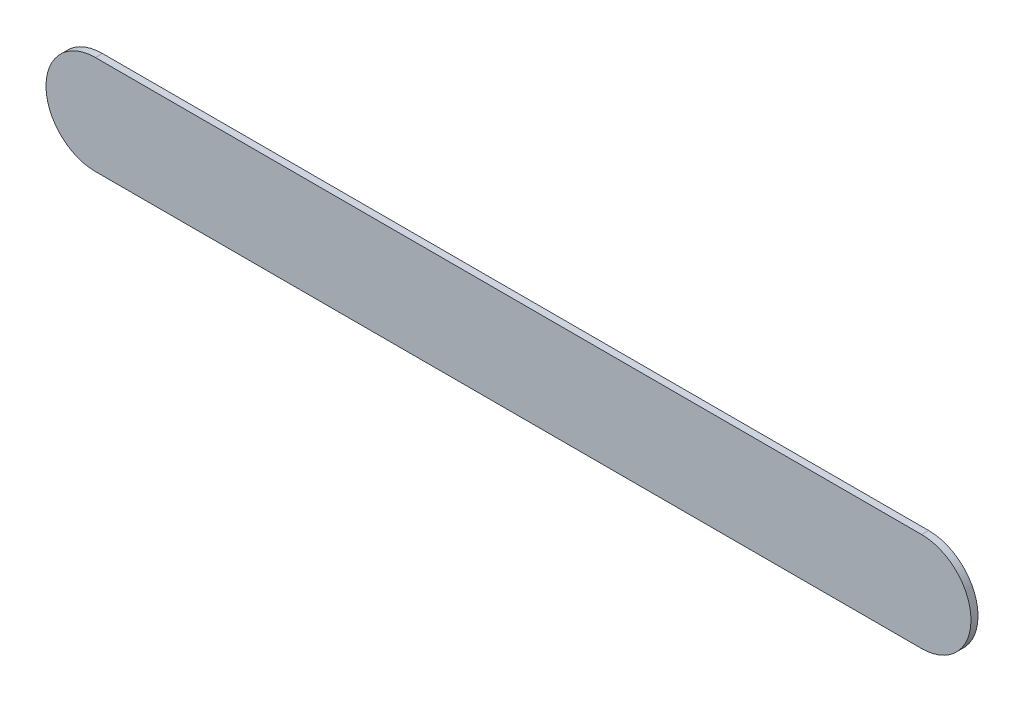
ISO-10303-21;
HEADER;
FILE_DESCRIPTION(('STEP AP214'),'2;1');
FILE_NAME('part.step','',(''),(''),'','','');
FILE_SCHEMA(('AUTOMOTIVE_DESIGN { 1 0 10303 214 1 1 1 1 }'));
ENDSEC;
DATA;
#1=APPLICATION_CONTEXT('core data for automotive mechanical design processes');
#2=APPLICATION_PROTOCOL_DEFINITION('international standard','automotive_design',2000,#1);
#3=PRODUCT_CONTEXT('',#1,'mechanical');
#4=PRODUCT('Part','Part','',(#3));
#5=PRODUCT_RELATED_PRODUCT_CATEGORY('part','',(#4));
#6=PRODUCT_DEFINITION_FORMATION('','',#4);
#7=PRODUCT_DEFINITION_CONTEXT('part definition',#1,'design');
#8=PRODUCT_DEFINITION('design','',#6,#7);
#9=PRODUCT_DEFINITION_SHAPE('','',#8);
#10=(LENGTH_UNIT() NAMED_UNIT(*) SI_UNIT(.MILLI.,.METRE.));
#11=(NAMED_UNIT(*) PLANE_ANGLE_UNIT() SI_UNIT($,.RADIAN.));
#12=(NAMED_UNIT(*) SI_UNIT($,.STERADIAN.) SOLID_ANGLE_UNIT());
#13=UNCERTAINTY_MEASURE_WITH_UNIT(LENGTH_MEASURE(1.E-05),#10,'distance_accuracy_value','');
#14=(GEOMETRIC_REPRESENTATION_CONTEXT(3) GLOBAL_UNCERTAINTY_ASSIGNED_CONTEXT((#13)) GLOBAL_UNIT_ASSIGNED_CONTEXT((#10,
#11,#12)) REPRESENTATION_CONTEXT('',''));
#15=CARTESIAN_POINT('',(0.,0.,0.));
#16=DIRECTION('',(0.,0.,1.));
#17=DIRECTION('',(1.,0.,0.));
#18=AXIS2_PLACEMENT_3D('',#15,#16,#17);
#19=CARTESIAN_POINT('',(88.36201276,97.71201184,0.));
#20=DIRECTION('',(0.,1.,0.));
#21=DIRECTION('',(1.,0.,0.));
#22=AXIS2_PLACEMENT_3D('',#19,#20,#21);
#23=PLANE('',#22);
#24=DIRECTION('',(1.,0.,0.));
#25=VECTOR('',#24,1.);
#26=CARTESIAN_POINT('',(88.36201276,97.71201184,0.03556));
#27=LINE('',#26,#25);
#28=CARTESIAN_POINT('',(88.36201276,97.71201184,0.03556));
#29=VERTEX_POINT('',#28);
#30=CARTESIAN_POINT('',(92.54500414,97.71201184,0.03556));
#31=VERTEX_POINT('',#30);
#32=EDGE_CURVE('E11',#29,#31,#27,.T.);
#33=ORIENTED_EDGE('',*,*,#32,.F.);
#34=DIRECTION('',(0.,0.,1.));
#35=VECTOR('',#34,1.);
#36=CARTESIAN_POINT('',(88.36201276,97.71201184,0.));
#37=LINE('',#36,#35);
#38=CARTESIAN_POINT('',(88.36201276,97.71201184,0.));
#39=VERTEX_POINT('',#38);
#40=EDGE_CURVE('E24',#39,#29,#37,.T.);
#41=ORIENTED_EDGE('',*,*,#40,.F.);
#42=DIRECTION('',(1.,0.,0.));
#43=VECTOR('',#42,1.);
#44=CARTESIAN_POINT('',(88.36201276,97.71201184,0.));
#45=LINE('',#44,#43);
#46=CARTESIAN_POINT('',(92.54500414,97.71201184,0.));
#47=VERTEX_POINT('',#46);
#48=EDGE_CURVE('E75',#39,#47,#45,.T.);
#49=ORIENTED_EDGE('',*,*,#48,.T.);
#50=DIRECTION('',(0.,0.,1.));
#51=VECTOR('',#50,1.);
#52=CARTESIAN_POINT('',(92.54500414,97.71201184,0.));
#53=LINE('',#52,#51);
#54=EDGE_CURVE('E37',#47,#31,#53,.T.);
#55=ORIENTED_EDGE('',*,*,#54,.T.);
#56=EDGE_LOOP('',(#33,#41,#49,#55));
#57=FACE_BOUND('',#56,.T.);
#58=ADVANCED_FACE('F17',(#57),#23,.F.);
#59=CARTESIAN_POINT('',(92.54500414,97.96201134,0.));
#60=DIRECTION('',(0.,0.,-1.));
#61=DIRECTION('',(0.,-1.,0.));
#62=AXIS2_PLACEMENT_3D('',#59,#60,#61);
#63=CYLINDRICAL_SURFACE('',#62,0.249999500000001);
#64=CARTESIAN_POINT('',(92.54500414,97.96201134,0.03556));
#65=DIRECTION('',(0.,0.,1.));
#66=DIRECTION('',(0.,-1.,0.));
#67=AXIS2_PLACEMENT_3D('',#64,#65,#66);
#68=CIRCLE('',#67,0.249999500000001);
#69=CARTESIAN_POINT('',(92.54500414,98.21201084,0.03556));
#70=VERTEX_POINT('',#69);
#71=EDGE_CURVE('E83',#31,#70,#68,.T.);
#72=ORIENTED_EDGE('',*,*,#71,.F.);
#73=ORIENTED_EDGE('',*,*,#54,.F.);
#74=CARTESIAN_POINT('',(92.54500414,97.96201134,0.));
#75=DIRECTION('',(0.,0.,1.));
#76=DIRECTION('',(0.,-1.,0.));
#77=AXIS2_PLACEMENT_3D('',#74,#75,#76);
#78=CIRCLE('',#77,0.249999500000001);
#79=CARTESIAN_POINT('',(92.54500414,98.21201084,0.));
#80=VERTEX_POINT('',#79);
#81=EDGE_CURVE('E81',#47,#80,#78,.T.);
#82=ORIENTED_EDGE('',*,*,#81,.T.);
#83=DIRECTION('',(0.,0.,1.));
#84=VECTOR('',#83,1.);
#85=CARTESIAN_POINT('',(92.54500414,98.21201084,0.));
#86=LINE('',#85,#84);
#87=EDGE_CURVE('E67',#80,#70,#86,.T.);
#88=ORIENTED_EDGE('',*,*,#87,.T.);
#89=EDGE_LOOP('',(#72,#73,#82,#88));
#90=FACE_BOUND('',#89,.T.);
#91=ADVANCED_FACE('F89',(#90),#63,.T.);
#92=CARTESIAN_POINT('',(92.54500414,98.21201084,0.));
#93=DIRECTION('',(0.,-1.,0.));
#94=DIRECTION('',(-1.,0.,0.));
#95=AXIS2_PLACEMENT_3D('',#92,#93,#94);
#96=PLANE('',#95);
#97=DIRECTION('',(-1.,0.,0.));
#98=VECTOR('',#97,1.);
#99=CARTESIAN_POINT('',(92.54500414,98.21201084,0.03556));
#100=LINE('',#99,#98);
#101=CARTESIAN_POINT('',(88.36201276,98.21201084,0.03556));
#102=VERTEX_POINT('',#101);
#103=EDGE_CURVE('E71',#70,#102,#100,.T.);
#104=ORIENTED_EDGE('',*,*,#103,.F.);
#105=ORIENTED_EDGE('',*,*,#87,.F.);
#106=DIRECTION('',(-1.,0.,0.));
#107=VECTOR('',#106,1.);
#108=CARTESIAN_POINT('',(92.54500414,98.21201084,0.));
#109=LINE('',#108,#107);
#110=CARTESIAN_POINT('',(88.36201276,98.21201084,0.));
#111=VERTEX_POINT('',#110);
#112=EDGE_CURVE('E63',#80,#111,#109,.T.);
#113=ORIENTED_EDGE('',*,*,#112,.T.);
#114=DIRECTION('',(0.,0.,1.));
#115=VECTOR('',#114,1.);
#116=CARTESIAN_POINT('',(88.36201276,98.21201084,0.));
#117=LINE('',#116,#115);
#118=EDGE_CURVE('E53',#111,#102,#117,.T.);
#119=ORIENTED_EDGE('',*,*,#118,.T.);
#120=EDGE_LOOP('',(#104,#105,#113,#119));
#121=FACE_BOUND('',#120,.T.);
#122=ADVANCED_FACE('F66',(#121),#96,.F.);
#123=CARTESIAN_POINT('',(88.36201276,97.96201134,0.));
#124=DIRECTION('',(0.,0.,-1.));
#125=DIRECTION('',(0.,1.,0.));
#126=AXIS2_PLACEMENT_3D('',#123,#124,#125);
#127=CYLINDRICAL_SURFACE('',#126,0.249999500000001);
#128=CARTESIAN_POINT('',(88.36201276,97.96201134,0.03556));
#129=DIRECTION('',(0.,0.,1.));
#130=DIRECTION('',(0.,1.,0.));
#131=AXIS2_PLACEMENT_3D('',#128,#129,#130);
#132=CIRCLE('',#131,0.249999500000001);
#133=EDGE_CURVE('E59',#102,#29,#132,.T.);
#134=ORIENTED_EDGE('',*,*,#133,.F.);
#135=ORIENTED_EDGE('',*,*,#118,.F.);
#136=CARTESIAN_POINT('',(88.36201276,97.96201134,0.));
#137=DIRECTION('',(0.,0.,1.));
#138=DIRECTION('',(0.,1.,0.));
#139=AXIS2_PLACEMENT_3D('',#136,#137,#138);
#140=CIRCLE('',#139,0.249999500000001);
#141=EDGE_CURVE('E57',#111,#39,#140,.T.);
#142=ORIENTED_EDGE('',*,*,#141,.T.);
#143=ORIENTED_EDGE('',*,*,#40,.T.);
#144=EDGE_LOOP('',(#134,#135,#142,#143));
#145=FACE_BOUND('',#144,.T.);
#146=ADVANCED_FACE('F55',(#145),#127,.T.);
#147=CARTESIAN_POINT('',(88.36201276,97.71201184,0.));
#148=DIRECTION('',(0.,0.,-1.));
#149=DIRECTION('',(-1.,0.,0.));
#150=AXIS2_PLACEMENT_3D('',#147,#148,#149);
#151=PLANE('',#150);
#152=ORIENTED_EDGE('',*,*,#141,.F.);
#153=ORIENTED_EDGE('',*,*,#112,.F.);
#154=ORIENTED_EDGE('',*,*,#81,.F.);
#155=ORIENTED_EDGE('',*,*,#48,.F.);
#156=EDGE_LOOP('',(#152,#153,#154,#155));
#157=FACE_BOUND('',#156,.T.);
#158=ADVANCED_FACE('F74',(#157),#151,.T.);
#159=CARTESIAN_POINT('',(88.36201276,97.71201184,0.03556));
#160=DIRECTION('',(0.,0.,-1.));
#161=DIRECTION('',(-1.,0.,0.));
#162=AXIS2_PLACEMENT_3D('',#159,#160,#161);
#163=PLANE('',#162);
#164=ORIENTED_EDGE('',*,*,#32,.T.);
#165=ORIENTED_EDGE('',*,*,#71,.T.);
#166=ORIENTED_EDGE('',*,*,#103,.T.);
#167=ORIENTED_EDGE('',*,*,#133,.T.);
#168=EDGE_LOOP('',(#164,#165,#166,#167));
#169=FACE_BOUND('',#168,.T.);
#170=ADVANCED_FACE('F91',(#169),#163,.F.);
#171=CLOSED_SHELL('',(#58,#91,#122,#146,#158,#170));
#172=MANIFOLD_SOLID_BREP('B1',#171);
#173=ADVANCED_BREP_SHAPE_REPRESENTATION('',(#18,#172),#14);
#174=SHAPE_DEFINITION_REPRESENTATION(#9,#173);
ENDSEC;
END-ISO-10303-21;
